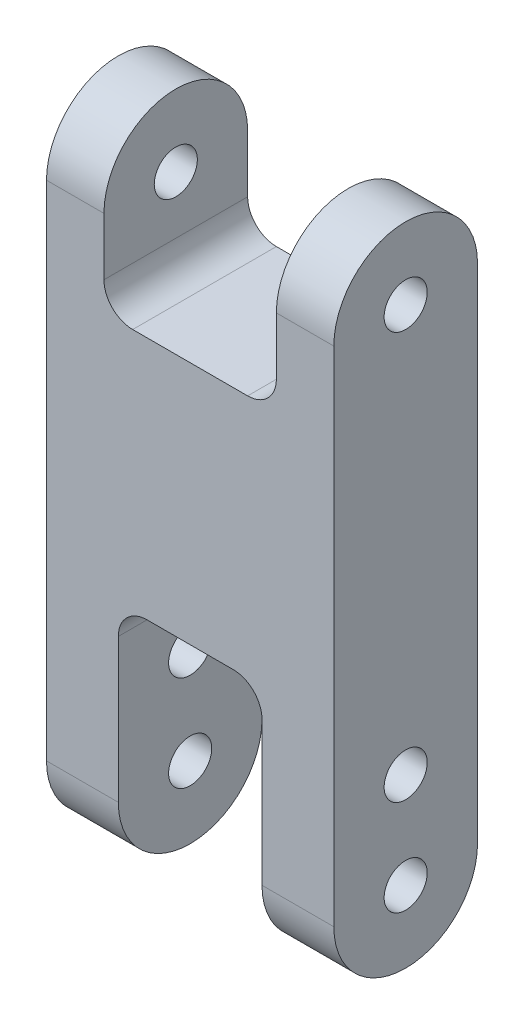
ISO-10303-21;
HEADER;
FILE_DESCRIPTION(('STEP AP214'),'2;1');
FILE_NAME('part.step','',(''),(''),'','','');
FILE_SCHEMA(('AUTOMOTIVE_DESIGN { 1 0 10303 214 1 1 1 1 }'));
ENDSEC;
DATA;
#1=APPLICATION_CONTEXT('core data for automotive mechanical design processes');
#2=APPLICATION_PROTOCOL_DEFINITION('international standard','automotive_design',2000,#1);
#3=PRODUCT_CONTEXT('',#1,'mechanical');
#4=PRODUCT('Part','Part','',(#3));
#5=PRODUCT_RELATED_PRODUCT_CATEGORY('part','',(#4));
#6=PRODUCT_DEFINITION_FORMATION('','',#4);
#7=PRODUCT_DEFINITION_CONTEXT('part definition',#1,'design');
#8=PRODUCT_DEFINITION('design','',#6,#7);
#9=PRODUCT_DEFINITION_SHAPE('','',#8);
#10=(LENGTH_UNIT() NAMED_UNIT(*) SI_UNIT(.MILLI.,.METRE.));
#11=(NAMED_UNIT(*) PLANE_ANGLE_UNIT() SI_UNIT($,.RADIAN.));
#12=(NAMED_UNIT(*) SI_UNIT($,.STERADIAN.) SOLID_ANGLE_UNIT());
#13=UNCERTAINTY_MEASURE_WITH_UNIT(LENGTH_MEASURE(1.E-05),#10,'distance_accuracy_value','');
#14=(GEOMETRIC_REPRESENTATION_CONTEXT(3) GLOBAL_UNCERTAINTY_ASSIGNED_CONTEXT((#13)) GLOBAL_UNIT_ASSIGNED_CONTEXT((#10,
#11,#12)) REPRESENTATION_CONTEXT('',''));
#15=CARTESIAN_POINT('',(0.,0.,0.));
#16=DIRECTION('',(0.,0.,1.));
#17=DIRECTION('',(1.,0.,0.));
#18=AXIS2_PLACEMENT_3D('',#15,#16,#17);
#19=CARTESIAN_POINT('',(-13.5185086744538,19.1447570284714,10.));
#20=DIRECTION('',(1.,0.,0.));
#21=DIRECTION('',(0.,1.,0.));
#22=AXIS2_PLACEMENT_3D('',#19,#20,#21);
#23=PLANE('',#22);
#24=CARTESIAN_POINT('',(-13.5185086744538,14.1447570284714,5.));
#25=DIRECTION('',(-1.,0.,0.));
#26=DIRECTION('',(0.,0.,1.));
#27=AXIS2_PLACEMENT_3D('',#24,#25,#26);
#28=CIRCLE('',#27,1.5);
#29=CARTESIAN_POINT('',(-13.5185086744538,14.1447570284714,6.5));
#30=VERTEX_POINT('',#29);
#31=EDGE_CURVE('E442',#30,#30,#28,.T.);
#32=ORIENTED_EDGE('',*,*,#31,.F.);
#33=EDGE_LOOP('',(#32));
#34=FACE_BOUND('',#33,.T.);
#35=CARTESIAN_POINT('',(-13.5185086744538,-20.8552429715286,5.));
#36=DIRECTION('',(-1.,0.,0.));
#37=DIRECTION('',(0.,0.,1.));
#38=AXIS2_PLACEMENT_3D('',#35,#36,#37);
#39=CIRCLE('',#38,1.5);
#40=CARTESIAN_POINT('',(-13.5185086744538,-20.8552429715286,6.5));
#41=VERTEX_POINT('',#40);
#42=EDGE_CURVE('E285',#41,#41,#39,.T.);
#43=ORIENTED_EDGE('',*,*,#42,.F.);
#44=EDGE_LOOP('',(#43));
#45=FACE_BOUND('',#44,.T.);
#46=CARTESIAN_POINT('',(-13.5185086744538,14.1447570284714,5.));
#47=DIRECTION('',(-1.,0.,0.));
#48=DIRECTION('',(0.,0.,1.));
#49=AXIS2_PLACEMENT_3D('',#46,#47,#48);
#50=CIRCLE('',#49,5.);
#51=CARTESIAN_POINT('',(-13.5185086744538,14.1447570284714,0.));
#52=VERTEX_POINT('',#51);
#53=CARTESIAN_POINT('',(-13.5185086744538,14.1447570284714,10.));
#54=VERTEX_POINT('',#53);
#55=EDGE_CURVE('E310',#52,#54,#50,.F.);
#56=ORIENTED_EDGE('',*,*,#55,.F.);
#57=DIRECTION('',(0.,-1.,0.));
#58=VECTOR('',#57,1.);
#59=CARTESIAN_POINT('',(-13.5185086744538,19.1447570284714,0.));
#60=LINE('',#59,#58);
#61=CARTESIAN_POINT('',(-13.5185086744538,-20.8552429715286,0.));
#62=VERTEX_POINT('',#61);
#63=EDGE_CURVE('E325',#52,#62,#60,.T.);
#64=ORIENTED_EDGE('',*,*,#63,.T.);
#65=CARTESIAN_POINT('',(-13.5185086744538,-20.8552429715286,5.));
#66=DIRECTION('',(-1.,0.,0.));
#67=DIRECTION('',(0.,0.,1.));
#68=AXIS2_PLACEMENT_3D('',#65,#66,#67);
#69=CIRCLE('',#68,5.);
#70=CARTESIAN_POINT('',(-13.5185086744538,-20.8552429715286,10.));
#71=VERTEX_POINT('',#70);
#72=EDGE_CURVE('E314',#62,#71,#69,.T.);
#73=ORIENTED_EDGE('',*,*,#72,.T.);
#74=DIRECTION('',(0.,-1.,0.));
#75=VECTOR('',#74,1.);
#76=CARTESIAN_POINT('',(-13.5185086744538,19.1447570284714,10.));
#77=LINE('',#76,#75);
#78=EDGE_CURVE('E255',#54,#71,#77,.T.);
#79=ORIENTED_EDGE('',*,*,#78,.F.);
#80=EDGE_LOOP('',(#56,#64,#73,#79));
#81=FACE_BOUND('',#80,.T.);
#82=CARTESIAN_POINT('',(-13.5185086744538,-14.1952429715286,5.));
#83=DIRECTION('',(-1.,0.,0.));
#84=DIRECTION('',(0.,0.,1.));
#85=AXIS2_PLACEMENT_3D('',#82,#83,#84);
#86=CIRCLE('',#85,1.5);
#87=CARTESIAN_POINT('',(-13.5185086744538,-14.1952429715286,6.5));
#88=VERTEX_POINT('',#87);
#89=EDGE_CURVE('E581',#88,#88,#86,.T.);
#90=ORIENTED_EDGE('',*,*,#89,.F.);
#91=EDGE_LOOP('',(#90));
#92=FACE_BOUND('',#91,.T.);
#93=ADVANCED_FACE('F99',(#34,#45,#81,#92),#23,.F.);
#94=CARTESIAN_POINT('',(6.48149132554615,19.1447570284714,10.));
#95=DIRECTION('',(1.,0.,0.));
#96=DIRECTION('',(0.,1.,0.));
#97=AXIS2_PLACEMENT_3D('',#94,#95,#96);
#98=PLANE('',#97);
#99=CARTESIAN_POINT('',(6.48149132554615,-20.8552429715286,5.));
#100=DIRECTION('',(-1.,0.,0.));
#101=DIRECTION('',(0.,0.,1.));
#102=AXIS2_PLACEMENT_3D('',#99,#100,#101);
#103=CIRCLE('',#102,1.5);
#104=CARTESIAN_POINT('',(6.48149132554615,-20.8552429715286,6.5));
#105=VERTEX_POINT('',#104);
#106=EDGE_CURVE('E302',#105,#105,#103,.T.);
#107=ORIENTED_EDGE('',*,*,#106,.T.);
#108=EDGE_LOOP('',(#107));
#109=FACE_BOUND('',#108,.T.);
#110=DIRECTION('',(0.,-1.,0.));
#111=VECTOR('',#110,1.);
#112=CARTESIAN_POINT('',(6.48149132554615,19.1447570284714,0.));
#113=LINE('',#112,#111);
#114=CARTESIAN_POINT('',(6.48149132554615,14.1447570284714,0.));
#115=VERTEX_POINT('',#114);
#116=CARTESIAN_POINT('',(6.48149132554615,-20.8552429715286,0.));
#117=VERTEX_POINT('',#116);
#118=EDGE_CURVE('E228',#115,#117,#113,.T.);
#119=ORIENTED_EDGE('',*,*,#118,.F.);
#120=CARTESIAN_POINT('',(6.48149132554615,14.1447570284714,5.));
#121=DIRECTION('',(-1.,0.,0.));
#122=DIRECTION('',(0.,0.,1.));
#123=AXIS2_PLACEMENT_3D('',#120,#121,#122);
#124=CIRCLE('',#123,5.);
#125=CARTESIAN_POINT('',(6.48149132554615,14.1447570284714,10.));
#126=VERTEX_POINT('',#125);
#127=EDGE_CURVE('E214',#115,#126,#124,.F.);
#128=ORIENTED_EDGE('',*,*,#127,.T.);
#129=DIRECTION('',(0.,-1.,0.));
#130=VECTOR('',#129,1.);
#131=CARTESIAN_POINT('',(6.48149132554615,19.1447570284714,10.));
#132=LINE('',#131,#130);
#133=CARTESIAN_POINT('',(6.48149132554615,-20.8552429715286,10.));
#134=VERTEX_POINT('',#133);
#135=EDGE_CURVE('E123',#126,#134,#132,.T.);
#136=ORIENTED_EDGE('',*,*,#135,.T.);
#137=CARTESIAN_POINT('',(6.48149132554615,-20.8552429715286,5.));
#138=DIRECTION('',(-1.,0.,0.));
#139=DIRECTION('',(0.,0.,1.));
#140=AXIS2_PLACEMENT_3D('',#137,#138,#139);
#141=CIRCLE('',#140,5.);
#142=EDGE_CURVE('E237',#117,#134,#141,.T.);
#143=ORIENTED_EDGE('',*,*,#142,.F.);
#144=EDGE_LOOP('',(#119,#128,#136,#143));
#145=FACE_BOUND('',#144,.T.);
#146=CARTESIAN_POINT('',(6.48149132554615,14.1447570284714,5.));
#147=DIRECTION('',(-1.,0.,0.));
#148=DIRECTION('',(0.,0.,1.));
#149=AXIS2_PLACEMENT_3D('',#146,#147,#148);
#150=CIRCLE('',#149,1.5);
#151=CARTESIAN_POINT('',(6.48149132554615,14.1447570284714,6.5));
#152=VERTEX_POINT('',#151);
#153=EDGE_CURVE('E391',#152,#152,#150,.T.);
#154=ORIENTED_EDGE('',*,*,#153,.T.);
#155=EDGE_LOOP('',(#154));
#156=FACE_BOUND('',#155,.T.);
#157=CARTESIAN_POINT('',(6.48149132554615,-14.1952429715286,5.));
#158=DIRECTION('',(-1.,0.,0.));
#159=DIRECTION('',(0.,0.,1.));
#160=AXIS2_PLACEMENT_3D('',#157,#158,#159);
#161=CIRCLE('',#160,1.5);
#162=CARTESIAN_POINT('',(6.48149132554615,-14.1952429715286,6.5));
#163=VERTEX_POINT('',#162);
#164=EDGE_CURVE('E583',#163,#163,#161,.T.);
#165=ORIENTED_EDGE('',*,*,#164,.T.);
#166=EDGE_LOOP('',(#165));
#167=FACE_BOUND('',#166,.T.);
#168=ADVANCED_FACE('F235',(#109,#145,#156,#167),#98,.T.);
#169=CARTESIAN_POINT('',(-6.51850867445384,-10.8552429715286,0.));
#170=DIRECTION('',(0.,0.,-1.));
#171=DIRECTION('',(-1.,0.,0.));
#172=AXIS2_PLACEMENT_3D('',#169,#170,#171);
#173=PLANE('',#172);
#174=ORIENTED_EDGE('',*,*,#63,.F.);
#175=DIRECTION('',(-1.,0.,0.));
#176=VECTOR('',#175,1.);
#177=CARTESIAN_POINT('',(6.48149132554615,14.1447570284714,0.));
#178=LINE('',#177,#176);
#179=CARTESIAN_POINT('',(-9.51850867445384,14.1447570284714,0.));
#180=VERTEX_POINT('',#179);
#181=EDGE_CURVE('E233',#180,#52,#178,.T.);
#182=ORIENTED_EDGE('',*,*,#181,.F.);
#183=DIRECTION('',(0.,1.,0.));
#184=VECTOR('',#183,1.);
#185=CARTESIAN_POINT('',(-9.51850867445384,10.1447570284714,0.));
#186=LINE('',#185,#184);
#187=CARTESIAN_POINT('',(-9.51850867445384,10.1447570284714,0.));
#188=VERTEX_POINT('',#187);
#189=EDGE_CURVE('E252',#188,#180,#186,.T.);
#190=ORIENTED_EDGE('',*,*,#189,.F.);
#191=CARTESIAN_POINT('',(-7.51850867445384,10.1447570284714,0.));
#192=DIRECTION('',(0.,0.,-1.));
#193=DIRECTION('',(-1.,0.,0.));
#194=AXIS2_PLACEMENT_3D('',#191,#192,#193);
#195=CIRCLE('',#194,2.);
#196=CARTESIAN_POINT('',(-7.51850867445383,8.14475702847143,0.));
#197=VERTEX_POINT('',#196);
#198=EDGE_CURVE('E250',#197,#188,#195,.T.);
#199=ORIENTED_EDGE('',*,*,#198,.F.);
#200=DIRECTION('',(-1.,0.,0.));
#201=VECTOR('',#200,1.);
#202=CARTESIAN_POINT('',(0.481491325546142,8.14475702847143,0.));
#203=LINE('',#202,#201);
#204=CARTESIAN_POINT('',(0.481491325546142,8.14475702847143,0.));
#205=VERTEX_POINT('',#204);
#206=EDGE_CURVE('E248',#205,#197,#203,.T.);
#207=ORIENTED_EDGE('',*,*,#206,.F.);
#208=CARTESIAN_POINT('',(0.481491325546156,10.1447570284714,0.));
#209=DIRECTION('',(0.,0.,-1.));
#210=DIRECTION('',(-1.,0.,0.));
#211=AXIS2_PLACEMENT_3D('',#208,#209,#210);
#212=CIRCLE('',#211,2.);
#213=CARTESIAN_POINT('',(2.48149132554616,10.1447570284714,0.));
#214=VERTEX_POINT('',#213);
#215=EDGE_CURVE('E241',#214,#205,#212,.T.);
#216=ORIENTED_EDGE('',*,*,#215,.F.);
#217=DIRECTION('',(0.,1.,0.));
#218=VECTOR('',#217,1.);
#219=CARTESIAN_POINT('',(2.48149132554616,10.1447570284714,0.));
#220=LINE('',#219,#218);
#221=CARTESIAN_POINT('',(2.48149132554616,14.1447570284714,0.));
#222=VERTEX_POINT('',#221);
#223=EDGE_CURVE('E231',#214,#222,#220,.T.);
#224=ORIENTED_EDGE('',*,*,#223,.T.);
#225=EDGE_CURVE('E217',#115,#222,#178,.T.);
#226=ORIENTED_EDGE('',*,*,#225,.F.);
#227=ORIENTED_EDGE('',*,*,#118,.T.);
#228=DIRECTION('',(-1.,0.,0.));
#229=VECTOR('',#228,1.);
#230=CARTESIAN_POINT('',(6.48149132554615,-20.8552429715286,0.));
#231=LINE('',#230,#229);
#232=CARTESIAN_POINT('',(1.48149132554616,-20.8552429715286,0.));
#233=VERTEX_POINT('',#232);
#234=EDGE_CURVE('E300',#117,#233,#231,.T.);
#235=ORIENTED_EDGE('',*,*,#234,.T.);
#236=DIRECTION('',(0.,1.,0.));
#237=VECTOR('',#236,1.);
#238=CARTESIAN_POINT('',(1.48149132554616,-25.8552429715286,0.));
#239=LINE('',#238,#237);
#240=CARTESIAN_POINT('',(1.48149132554616,-10.8552429715286,0.));
#241=VERTEX_POINT('',#240);
#242=EDGE_CURVE('E239',#233,#241,#239,.T.);
#243=ORIENTED_EDGE('',*,*,#242,.T.);
#244=CARTESIAN_POINT('',(-0.518508674453842,-10.8552429715286,0.));
#245=DIRECTION('',(0.,0.,1.));
#246=DIRECTION('',(1.,0.,0.));
#247=AXIS2_PLACEMENT_3D('',#244,#245,#246);
#248=CIRCLE('',#247,2.);
#249=CARTESIAN_POINT('',(-0.518508674453842,-8.85524297152857,0.));
#250=VERTEX_POINT('',#249);
#251=EDGE_CURVE('E243',#241,#250,#248,.T.);
#252=ORIENTED_EDGE('',*,*,#251,.T.);
#253=DIRECTION('',(1.,0.,0.));
#254=VECTOR('',#253,1.);
#255=CARTESIAN_POINT('',(-6.51850867445384,-8.85524297152857,0.));
#256=LINE('',#255,#254);
#257=CARTESIAN_POINT('',(-6.51850867445384,-8.85524297152857,0.));
#258=VERTEX_POINT('',#257);
#259=EDGE_CURVE('E355',#258,#250,#256,.T.);
#260=ORIENTED_EDGE('',*,*,#259,.F.);
#261=CARTESIAN_POINT('',(-6.51850867445384,-10.8552429715286,0.));
#262=DIRECTION('',(0.,0.,-1.));
#263=DIRECTION('',(-1.,0.,0.));
#264=AXIS2_PLACEMENT_3D('',#261,#262,#263);
#265=CIRCLE('',#264,2.);
#266=CARTESIAN_POINT('',(-8.51850867445384,-10.8552429715286,0.));
#267=VERTEX_POINT('',#266);
#268=EDGE_CURVE('E353',#267,#258,#265,.T.);
#269=ORIENTED_EDGE('',*,*,#268,.F.);
#270=DIRECTION('',(0.,1.,0.));
#271=VECTOR('',#270,1.);
#272=CARTESIAN_POINT('',(-8.51850867445384,-25.8552429715286,0.));
#273=LINE('',#272,#271);
#274=CARTESIAN_POINT('',(-8.51850867445384,-20.8552429715286,0.));
#275=VERTEX_POINT('',#274);
#276=EDGE_CURVE('E351',#275,#267,#273,.T.);
#277=ORIENTED_EDGE('',*,*,#276,.F.);
#278=DIRECTION('',(-1.,0.,0.));
#279=VECTOR('',#278,1.);
#280=CARTESIAN_POINT('',(6.48149132554615,-20.8552429715286,0.));
#281=LINE('',#280,#279);
#282=EDGE_CURVE('E12',#275,#62,#281,.T.);
#283=ORIENTED_EDGE('',*,*,#282,.T.);
#284=EDGE_LOOP('',(#174,#182,#190,#199,#207,#216,#224,#226,#227,#235,#243,#252,#260,#269,#277,#283));
#285=FACE_BOUND('',#284,.T.);
#286=ADVANCED_FACE('F226',(#285),#173,.T.);
#287=CARTESIAN_POINT('',(2.48149132554616,10.1447570284714,10.));
#288=DIRECTION('',(-1.,0.,0.));
#289=DIRECTION('',(0.,-1.,0.));
#290=AXIS2_PLACEMENT_3D('',#287,#288,#289);
#291=PLANE('',#290);
#292=CARTESIAN_POINT('',(2.48149132554616,14.1447570284714,5.));
#293=DIRECTION('',(-1.,0.,0.));
#294=DIRECTION('',(0.,-1.,0.));
#295=AXIS2_PLACEMENT_3D('',#292,#293,#294);
#296=CIRCLE('',#295,5.);
#297=CARTESIAN_POINT('',(2.48149132554616,14.1447570284714,10.));
#298=VERTEX_POINT('',#297);
#299=EDGE_CURVE('E311',#222,#298,#296,.F.);
#300=ORIENTED_EDGE('',*,*,#299,.F.);
#301=ORIENTED_EDGE('',*,*,#223,.F.);
#302=DIRECTION('',(0.,0.,-1.));
#303=VECTOR('',#302,1.);
#304=CARTESIAN_POINT('',(2.48149132554616,10.1447570284714,10.));
#305=LINE('',#304,#303);
#306=CARTESIAN_POINT('',(2.48149132554616,10.1447570284714,10.));
#307=VERTEX_POINT('',#306);
#308=EDGE_CURVE('E266',#307,#214,#305,.T.);
#309=ORIENTED_EDGE('',*,*,#308,.F.);
#310=DIRECTION('',(0.,1.,0.));
#311=VECTOR('',#310,1.);
#312=CARTESIAN_POINT('',(2.48149132554616,10.1447570284714,10.));
#313=LINE('',#312,#311);
#314=EDGE_CURVE('E339',#307,#298,#313,.T.);
#315=ORIENTED_EDGE('',*,*,#314,.T.);
#316=EDGE_LOOP('',(#300,#301,#309,#315));
#317=FACE_BOUND('',#316,.T.);
#318=CARTESIAN_POINT('',(2.48149132554616,14.1447570284714,5.));
#319=DIRECTION('',(-1.,0.,0.));
#320=DIRECTION('',(0.,-1.,0.));
#321=AXIS2_PLACEMENT_3D('',#318,#319,#320);
#322=CIRCLE('',#321,1.5);
#323=CARTESIAN_POINT('',(2.48149132554616,12.6447570284714,5.));
#324=VERTEX_POINT('',#323);
#325=EDGE_CURVE('E287',#324,#324,#322,.T.);
#326=ORIENTED_EDGE('',*,*,#325,.F.);
#327=EDGE_LOOP('',(#326));
#328=FACE_BOUND('',#327,.T.);
#329=ADVANCED_FACE('F410',(#317,#328),#291,.T.);
#330=CARTESIAN_POINT('',(-9.51850867445384,10.1447570284714,10.));
#331=DIRECTION('',(-1.,0.,0.));
#332=DIRECTION('',(0.,0.,1.));
#333=AXIS2_PLACEMENT_3D('',#330,#331,#332);
#334=PLANE('',#333);
#335=ORIENTED_EDGE('',*,*,#189,.T.);
#336=CARTESIAN_POINT('',(-9.51850867445384,14.1447570284714,5.));
#337=DIRECTION('',(-1.,0.,0.));
#338=DIRECTION('',(0.,0.,1.));
#339=AXIS2_PLACEMENT_3D('',#336,#337,#338);
#340=CIRCLE('',#339,5.);
#341=CARTESIAN_POINT('',(-9.51850867445384,14.1447570284714,10.));
#342=VERTEX_POINT('',#341);
#343=EDGE_CURVE('E107',#180,#342,#340,.F.);
#344=ORIENTED_EDGE('',*,*,#343,.T.);
#345=DIRECTION('',(0.,1.,0.));
#346=VECTOR('',#345,1.);
#347=CARTESIAN_POINT('',(-9.51850867445384,10.1447570284714,10.));
#348=LINE('',#347,#346);
#349=CARTESIAN_POINT('',(-9.51850867445384,10.1447570284714,10.));
#350=VERTEX_POINT('',#349);
#351=EDGE_CURVE('E260',#350,#342,#348,.T.);
#352=ORIENTED_EDGE('',*,*,#351,.F.);
#353=DIRECTION('',(0.,0.,-1.));
#354=VECTOR('',#353,1.);
#355=CARTESIAN_POINT('',(-9.51850867445384,10.1447570284714,10.));
#356=LINE('',#355,#354);
#357=EDGE_CURVE('E256',#350,#188,#356,.T.);
#358=ORIENTED_EDGE('',*,*,#357,.T.);
#359=EDGE_LOOP('',(#335,#344,#352,#358));
#360=FACE_BOUND('',#359,.T.);
#361=CARTESIAN_POINT('',(-9.51850867445384,14.1447570284714,5.));
#362=DIRECTION('',(-1.,0.,0.));
#363=DIRECTION('',(0.,0.,1.));
#364=AXIS2_PLACEMENT_3D('',#361,#362,#363);
#365=CIRCLE('',#364,1.5);
#366=CARTESIAN_POINT('',(-9.51850867445384,14.1447570284714,6.5));
#367=VERTEX_POINT('',#366);
#368=EDGE_CURVE('E232',#367,#367,#365,.T.);
#369=ORIENTED_EDGE('',*,*,#368,.T.);
#370=EDGE_LOOP('',(#369));
#371=FACE_BOUND('',#370,.T.);
#372=ADVANCED_FACE('F393',(#360,#371),#334,.F.);
#373=CARTESIAN_POINT('',(-8.51850867445384,-25.8552429715286,10.));
#374=DIRECTION('',(-1.,0.,0.));
#375=DIRECTION('',(0.,-1.,0.));
#376=AXIS2_PLACEMENT_3D('',#373,#374,#375);
#377=PLANE('',#376);
#378=CARTESIAN_POINT('',(-8.51850867445384,-14.1952429715286,5.));
#379=DIRECTION('',(-1.,0.,0.));
#380=DIRECTION('',(0.,-1.,0.));
#381=AXIS2_PLACEMENT_3D('',#378,#379,#380);
#382=CIRCLE('',#381,1.5);
#383=CARTESIAN_POINT('',(-8.51850867445384,-15.6952429715286,5.));
#384=VERTEX_POINT('',#383);
#385=EDGE_CURVE('E295',#384,#384,#382,.T.);
#386=ORIENTED_EDGE('',*,*,#385,.T.);
#387=EDGE_LOOP('',(#386));
#388=FACE_BOUND('',#387,.T.);
#389=CARTESIAN_POINT('',(-8.51850867445384,-20.8552429715286,5.));
#390=DIRECTION('',(-1.,0.,0.));
#391=DIRECTION('',(0.,-1.,0.));
#392=AXIS2_PLACEMENT_3D('',#389,#390,#391);
#393=CIRCLE('',#392,1.5);
#394=CARTESIAN_POINT('',(-8.51850867445384,-22.3552429715286,5.));
#395=VERTEX_POINT('',#394);
#396=EDGE_CURVE('E222',#395,#395,#393,.T.);
#397=ORIENTED_EDGE('',*,*,#396,.T.);
#398=EDGE_LOOP('',(#397));
#399=FACE_BOUND('',#398,.T.);
#400=CARTESIAN_POINT('',(-8.51850867445384,-20.8552429715286,5.));
#401=DIRECTION('',(-1.,0.,0.));
#402=DIRECTION('',(0.,-1.,0.));
#403=AXIS2_PLACEMENT_3D('',#400,#401,#402);
#404=CIRCLE('',#403,5.);
#405=CARTESIAN_POINT('',(-8.51850867445384,-20.8552429715286,10.));
#406=VERTEX_POINT('',#405);
#407=EDGE_CURVE('E323',#275,#406,#404,.T.);
#408=ORIENTED_EDGE('',*,*,#407,.F.);
#409=ORIENTED_EDGE('',*,*,#276,.T.);
#410=DIRECTION('',(0.,0.,-1.));
#411=VECTOR('',#410,1.);
#412=CARTESIAN_POINT('',(-8.51850867445384,-10.8552429715286,10.));
#413=LINE('',#412,#411);
#414=CARTESIAN_POINT('',(-8.51850867445384,-10.8552429715286,10.));
#415=VERTEX_POINT('',#414);
#416=EDGE_CURVE('E276',#415,#267,#413,.T.);
#417=ORIENTED_EDGE('',*,*,#416,.F.);
#418=DIRECTION('',(0.,1.,0.));
#419=VECTOR('',#418,1.);
#420=CARTESIAN_POINT('',(-8.51850867445384,-25.8552429715286,10.));
#421=LINE('',#420,#419);
#422=EDGE_CURVE('E327',#406,#415,#421,.T.);
#423=ORIENTED_EDGE('',*,*,#422,.F.);
#424=EDGE_LOOP('',(#408,#409,#417,#423));
#425=FACE_BOUND('',#424,.T.);
#426=ADVANCED_FACE('F378',(#388,#399,#425),#377,.F.);
#427=CARTESIAN_POINT('',(1.48149132554616,-25.8552429715286,10.));
#428=DIRECTION('',(-1.,0.,0.));
#429=DIRECTION('',(0.,0.,1.));
#430=AXIS2_PLACEMENT_3D('',#427,#428,#429);
#431=PLANE('',#430);
#432=CARTESIAN_POINT('',(1.48149132554616,-14.1952429715286,5.));
#433=DIRECTION('',(-1.,0.,0.));
#434=DIRECTION('',(0.,0.,1.));
#435=AXIS2_PLACEMENT_3D('',#432,#433,#434);
#436=CIRCLE('',#435,1.5);
#437=CARTESIAN_POINT('',(1.48149132554616,-14.1952429715286,6.5));
#438=VERTEX_POINT('',#437);
#439=EDGE_CURVE('E102',#438,#438,#436,.T.);
#440=ORIENTED_EDGE('',*,*,#439,.F.);
#441=EDGE_LOOP('',(#440));
#442=FACE_BOUND('',#441,.T.);
#443=CARTESIAN_POINT('',(1.48149132554616,-20.8552429715286,5.));
#444=DIRECTION('',(-1.,0.,0.));
#445=DIRECTION('',(0.,0.,1.));
#446=AXIS2_PLACEMENT_3D('',#443,#444,#445);
#447=CIRCLE('',#446,1.5);
#448=CARTESIAN_POINT('',(1.48149132554616,-20.8552429715286,6.5));
#449=VERTEX_POINT('',#448);
#450=EDGE_CURVE('E283',#449,#449,#447,.T.);
#451=ORIENTED_EDGE('',*,*,#450,.F.);
#452=EDGE_LOOP('',(#451));
#453=FACE_BOUND('',#452,.T.);
#454=ORIENTED_EDGE('',*,*,#242,.F.);
#455=CARTESIAN_POINT('',(1.48149132554616,-20.8552429715286,5.));
#456=DIRECTION('',(-1.,0.,0.));
#457=DIRECTION('',(0.,0.,1.));
#458=AXIS2_PLACEMENT_3D('',#455,#456,#457);
#459=CIRCLE('',#458,5.);
#460=CARTESIAN_POINT('',(1.48149132554616,-20.8552429715286,10.));
#461=VERTEX_POINT('',#460);
#462=EDGE_CURVE('E320',#233,#461,#459,.T.);
#463=ORIENTED_EDGE('',*,*,#462,.T.);
#464=DIRECTION('',(0.,1.,0.));
#465=VECTOR('',#464,1.);
#466=CARTESIAN_POINT('',(1.48149132554616,-25.8552429715286,10.));
#467=LINE('',#466,#465);
#468=CARTESIAN_POINT('',(1.48149132554616,-10.8552429715286,10.));
#469=VERTEX_POINT('',#468);
#470=EDGE_CURVE('E336',#461,#469,#467,.T.);
#471=ORIENTED_EDGE('',*,*,#470,.T.);
#472=DIRECTION('',(0.,0.,-1.));
#473=VECTOR('',#472,1.);
#474=CARTESIAN_POINT('',(1.48149132554616,-10.8552429715286,10.));
#475=LINE('',#474,#473);
#476=EDGE_CURVE('E268',#469,#241,#475,.T.);
#477=ORIENTED_EDGE('',*,*,#476,.T.);
#478=EDGE_LOOP('',(#454,#463,#471,#477));
#479=FACE_BOUND('',#478,.T.);
#480=ADVANCED_FACE('F419',(#442,#453,#479),#431,.T.);
#481=CARTESIAN_POINT('',(-6.51850867445384,-10.8552429715286,10.));
#482=DIRECTION('',(0.,0.,-1.));
#483=DIRECTION('',(-1.,0.,0.));
#484=AXIS2_PLACEMENT_3D('',#481,#482,#483);
#485=PLANE('',#484);
#486=DIRECTION('',(-1.,0.,0.));
#487=VECTOR('',#486,1.);
#488=CARTESIAN_POINT('',(6.48149132554615,14.1447570284714,10.));
#489=LINE('',#488,#487);
#490=EDGE_CURVE('E115',#342,#54,#489,.T.);
#491=ORIENTED_EDGE('',*,*,#490,.T.);
#492=ORIENTED_EDGE('',*,*,#78,.T.);
#493=DIRECTION('',(-1.,0.,0.));
#494=VECTOR('',#493,1.);
#495=CARTESIAN_POINT('',(6.48149132554615,-20.8552429715286,10.));
#496=LINE('',#495,#494);
#497=EDGE_CURVE('E279',#406,#71,#496,.T.);
#498=ORIENTED_EDGE('',*,*,#497,.F.);
#499=ORIENTED_EDGE('',*,*,#422,.T.);
#500=CARTESIAN_POINT('',(-6.51850867445384,-10.8552429715286,10.));
#501=DIRECTION('',(0.,0.,-1.));
#502=DIRECTION('',(-1.,0.,0.));
#503=AXIS2_PLACEMENT_3D('',#500,#501,#502);
#504=CIRCLE('',#503,2.);
#505=CARTESIAN_POINT('',(-6.51850867445384,-8.85524297152857,10.));
#506=VERTEX_POINT('',#505);
#507=EDGE_CURVE('E329',#415,#506,#504,.T.);
#508=ORIENTED_EDGE('',*,*,#507,.T.);
#509=DIRECTION('',(1.,0.,0.));
#510=VECTOR('',#509,1.);
#511=CARTESIAN_POINT('',(-6.51850867445384,-8.85524297152857,10.));
#512=LINE('',#511,#510);
#513=CARTESIAN_POINT('',(-0.518508674453842,-8.85524297152857,10.));
#514=VERTEX_POINT('',#513);
#515=EDGE_CURVE('E331',#506,#514,#512,.T.);
#516=ORIENTED_EDGE('',*,*,#515,.T.);
#517=CARTESIAN_POINT('',(-0.518508674453842,-10.8552429715286,10.));
#518=DIRECTION('',(0.,0.,1.));
#519=DIRECTION('',(1.,0.,0.));
#520=AXIS2_PLACEMENT_3D('',#517,#518,#519);
#521=CIRCLE('',#520,2.);
#522=EDGE_CURVE('E333',#469,#514,#521,.T.);
#523=ORIENTED_EDGE('',*,*,#522,.F.);
#524=ORIENTED_EDGE('',*,*,#470,.F.);
#525=DIRECTION('',(-1.,0.,0.));
#526=VECTOR('',#525,1.);
#527=CARTESIAN_POINT('',(6.48149132554615,-20.8552429715286,10.));
#528=LINE('',#527,#526);
#529=EDGE_CURVE('E316',#134,#461,#528,.T.);
#530=ORIENTED_EDGE('',*,*,#529,.F.);
#531=ORIENTED_EDGE('',*,*,#135,.F.);
#532=EDGE_CURVE('E220',#126,#298,#489,.T.);
#533=ORIENTED_EDGE('',*,*,#532,.T.);
#534=ORIENTED_EDGE('',*,*,#314,.F.);
#535=CARTESIAN_POINT('',(0.481491325546156,10.1447570284714,10.));
#536=DIRECTION('',(0.,0.,-1.));
#537=DIRECTION('',(-1.,0.,0.));
#538=AXIS2_PLACEMENT_3D('',#535,#536,#537);
#539=CIRCLE('',#538,2.);
#540=CARTESIAN_POINT('',(0.481491325546142,8.14475702847143,10.));
#541=VERTEX_POINT('',#540);
#542=EDGE_CURVE('E342',#307,#541,#539,.T.);
#543=ORIENTED_EDGE('',*,*,#542,.T.);
#544=DIRECTION('',(-1.,0.,0.));
#545=VECTOR('',#544,1.);
#546=CARTESIAN_POINT('',(0.481491325546142,8.14475702847143,10.));
#547=LINE('',#546,#545);
#548=CARTESIAN_POINT('',(-7.51850867445383,8.14475702847143,10.));
#549=VERTEX_POINT('',#548);
#550=EDGE_CURVE('E344',#541,#549,#547,.T.);
#551=ORIENTED_EDGE('',*,*,#550,.T.);
#552=CARTESIAN_POINT('',(-7.51850867445384,10.1447570284714,10.));
#553=DIRECTION('',(0.,0.,-1.));
#554=DIRECTION('',(-1.,0.,0.));
#555=AXIS2_PLACEMENT_3D('',#552,#553,#554);
#556=CIRCLE('',#555,2.);
#557=EDGE_CURVE('E346',#549,#350,#556,.T.);
#558=ORIENTED_EDGE('',*,*,#557,.T.);
#559=ORIENTED_EDGE('',*,*,#351,.T.);
#560=EDGE_LOOP('',(#491,#492,#498,#499,#508,#516,#523,#524,#530,#531,#533,#534,#543,#551,#558,#559));
#561=FACE_BOUND('',#560,.T.);
#562=ADVANCED_FACE('F413',(#561),#485,.F.);
#563=CARTESIAN_POINT('',(-6.51850867445384,-10.8552429715286,10.));
#564=DIRECTION('',(0.,0.,-1.));
#565=DIRECTION('',(-1.,0.,0.));
#566=AXIS2_PLACEMENT_3D('',#563,#564,#565);
#567=CYLINDRICAL_SURFACE('',#566,2.);
#568=ORIENTED_EDGE('',*,*,#268,.T.);
#569=DIRECTION('',(0.,0.,-1.));
#570=VECTOR('',#569,1.);
#571=CARTESIAN_POINT('',(-6.51850867445384,-8.85524297152857,10.));
#572=LINE('',#571,#570);
#573=EDGE_CURVE('E273',#506,#258,#572,.T.);
#574=ORIENTED_EDGE('',*,*,#573,.F.);
#575=ORIENTED_EDGE('',*,*,#507,.F.);
#576=ORIENTED_EDGE('',*,*,#416,.T.);
#577=EDGE_LOOP('',(#568,#574,#575,#576));
#578=FACE_BOUND('',#577,.T.);
#579=ADVANCED_FACE('F373',(#578),#567,.F.);
#580=CARTESIAN_POINT('',(-6.51850867445384,-8.85524297152857,10.));
#581=DIRECTION('',(0.,1.,0.));
#582=DIRECTION('',(0.,0.,1.));
#583=AXIS2_PLACEMENT_3D('',#580,#581,#582);
#584=PLANE('',#583);
#585=ORIENTED_EDGE('',*,*,#259,.T.);
#586=DIRECTION('',(0.,0.,-1.));
#587=VECTOR('',#586,1.);
#588=CARTESIAN_POINT('',(-0.518508674453842,-8.85524297152857,10.));
#589=LINE('',#588,#587);
#590=EDGE_CURVE('E271',#514,#250,#589,.T.);
#591=ORIENTED_EDGE('',*,*,#590,.F.);
#592=ORIENTED_EDGE('',*,*,#515,.F.);
#593=ORIENTED_EDGE('',*,*,#573,.T.);
#594=EDGE_LOOP('',(#585,#591,#592,#593));
#595=FACE_BOUND('',#594,.T.);
#596=ADVANCED_FACE('F369',(#595),#584,.F.);
#597=CARTESIAN_POINT('',(-0.518508674453842,-10.8552429715286,10.));
#598=DIRECTION('',(0.,0.,-1.));
#599=DIRECTION('',(-1.,0.,0.));
#600=AXIS2_PLACEMENT_3D('',#597,#598,#599);
#601=CYLINDRICAL_SURFACE('',#600,2.);
#602=ORIENTED_EDGE('',*,*,#251,.F.);
#603=ORIENTED_EDGE('',*,*,#476,.F.);
#604=ORIENTED_EDGE('',*,*,#522,.T.);
#605=ORIENTED_EDGE('',*,*,#590,.T.);
#606=EDGE_LOOP('',(#602,#603,#604,#605));
#607=FACE_BOUND('',#606,.T.);
#608=ADVANCED_FACE('F364',(#607),#601,.F.);
#609=CARTESIAN_POINT('',(0.481491325546156,10.1447570284714,10.));
#610=DIRECTION('',(0.,0.,-1.));
#611=DIRECTION('',(-1.,0.,0.));
#612=AXIS2_PLACEMENT_3D('',#609,#610,#611);
#613=CYLINDRICAL_SURFACE('',#612,2.);
#614=ORIENTED_EDGE('',*,*,#215,.T.);
#615=DIRECTION('',(0.,0.,-1.));
#616=VECTOR('',#615,1.);
#617=CARTESIAN_POINT('',(0.481491325546142,8.14475702847143,10.));
#618=LINE('',#617,#616);
#619=EDGE_CURVE('E263',#541,#205,#618,.T.);
#620=ORIENTED_EDGE('',*,*,#619,.F.);
#621=ORIENTED_EDGE('',*,*,#542,.F.);
#622=ORIENTED_EDGE('',*,*,#308,.T.);
#623=EDGE_LOOP('',(#614,#620,#621,#622));
#624=FACE_BOUND('',#623,.T.);
#625=ADVANCED_FACE('F407',(#624),#613,.F.);
#626=CARTESIAN_POINT('',(0.481491325546142,8.14475702847143,10.));
#627=DIRECTION('',(0.,-1.,0.));
#628=DIRECTION('',(1.,0.,0.));
#629=AXIS2_PLACEMENT_3D('',#626,#627,#628);
#630=PLANE('',#629);
#631=ORIENTED_EDGE('',*,*,#206,.T.);
#632=DIRECTION('',(0.,0.,-1.));
#633=VECTOR('',#632,1.);
#634=CARTESIAN_POINT('',(-7.51850867445383,8.14475702847143,10.));
#635=LINE('',#634,#633);
#636=EDGE_CURVE('E259',#549,#197,#635,.T.);
#637=ORIENTED_EDGE('',*,*,#636,.F.);
#638=ORIENTED_EDGE('',*,*,#550,.F.);
#639=ORIENTED_EDGE('',*,*,#619,.T.);
#640=EDGE_LOOP('',(#631,#637,#638,#639));
#641=FACE_BOUND('',#640,.T.);
#642=ADVANCED_FACE('F402',(#641),#630,.F.);
#643=CARTESIAN_POINT('',(-7.51850867445384,10.1447570284714,10.));
#644=DIRECTION('',(0.,0.,-1.));
#645=DIRECTION('',(-1.,0.,0.));
#646=AXIS2_PLACEMENT_3D('',#643,#644,#645);
#647=CYLINDRICAL_SURFACE('',#646,2.);
#648=ORIENTED_EDGE('',*,*,#198,.T.);
#649=ORIENTED_EDGE('',*,*,#357,.F.);
#650=ORIENTED_EDGE('',*,*,#557,.F.);
#651=ORIENTED_EDGE('',*,*,#636,.T.);
#652=EDGE_LOOP('',(#648,#649,#650,#651));
#653=FACE_BOUND('',#652,.T.);
#654=ADVANCED_FACE('F398',(#653),#647,.F.);
#655=CARTESIAN_POINT('',(6.48149132554615,-20.8552429715286,5.));
#656=DIRECTION('',(-1.,0.,0.));
#657=DIRECTION('',(0.,0.,1.));
#658=AXIS2_PLACEMENT_3D('',#655,#656,#657);
#659=CYLINDRICAL_SURFACE('',#658,5.);
#660=ORIENTED_EDGE('',*,*,#407,.T.);
#661=ORIENTED_EDGE('',*,*,#497,.T.);
#662=ORIENTED_EDGE('',*,*,#72,.F.);
#663=ORIENTED_EDGE('',*,*,#282,.F.);
#664=EDGE_LOOP('',(#660,#661,#662,#663));
#665=FACE_BOUND('',#664,.T.);
#666=ADVANCED_FACE('F383',(#665),#659,.T.);
#667=ORIENTED_EDGE('',*,*,#462,.F.);
#668=ORIENTED_EDGE('',*,*,#234,.F.);
#669=ORIENTED_EDGE('',*,*,#142,.T.);
#670=ORIENTED_EDGE('',*,*,#529,.T.);
#671=EDGE_LOOP('',(#667,#668,#669,#670));
#672=FACE_BOUND('',#671,.T.);
#673=ADVANCED_FACE('F417',(#672),#659,.T.);
#674=CARTESIAN_POINT('',(6.48149132554615,14.1447570284714,5.));
#675=DIRECTION('',(-1.,0.,0.));
#676=DIRECTION('',(0.,0.,1.));
#677=AXIS2_PLACEMENT_3D('',#674,#675,#676);
#678=CYLINDRICAL_SURFACE('',#677,5.);
#679=ORIENTED_EDGE('',*,*,#343,.F.);
#680=ORIENTED_EDGE('',*,*,#181,.T.);
#681=ORIENTED_EDGE('',*,*,#55,.T.);
#682=ORIENTED_EDGE('',*,*,#490,.F.);
#683=EDGE_LOOP('',(#679,#680,#681,#682));
#684=FACE_BOUND('',#683,.T.);
#685=ADVANCED_FACE('F466',(#684),#678,.T.);
#686=ORIENTED_EDGE('',*,*,#299,.T.);
#687=ORIENTED_EDGE('',*,*,#532,.F.);
#688=ORIENTED_EDGE('',*,*,#127,.F.);
#689=ORIENTED_EDGE('',*,*,#225,.T.);
#690=EDGE_LOOP('',(#686,#687,#688,#689));
#691=FACE_BOUND('',#690,.T.);
#692=ADVANCED_FACE('F216',(#691),#678,.T.);
#693=CARTESIAN_POINT('',(6.48149132554615,-20.8552429715286,5.));
#694=DIRECTION('',(-1.,0.,0.));
#695=DIRECTION('',(0.,0.,1.));
#696=AXIS2_PLACEMENT_3D('',#693,#694,#695);
#697=CYLINDRICAL_SURFACE('',#696,1.5);
#698=ORIENTED_EDGE('',*,*,#450,.T.);
#699=EDGE_LOOP('',(#698));
#700=FACE_BOUND('',#699,.T.);
#701=ORIENTED_EDGE('',*,*,#106,.F.);
#702=EDGE_LOOP('',(#701));
#703=FACE_BOUND('',#702,.T.);
#704=ADVANCED_FACE('F449',(#700,#703),#697,.F.);
#705=ORIENTED_EDGE('',*,*,#42,.T.);
#706=EDGE_LOOP('',(#705));
#707=FACE_BOUND('',#706,.T.);
#708=ORIENTED_EDGE('',*,*,#396,.F.);
#709=EDGE_LOOP('',(#708));
#710=FACE_BOUND('',#709,.T.);
#711=ADVANCED_FACE('F445',(#707,#710),#697,.F.);
#712=CARTESIAN_POINT('',(6.48149132554615,14.1447570284714,5.));
#713=DIRECTION('',(-1.,0.,0.));
#714=DIRECTION('',(0.,0.,1.));
#715=AXIS2_PLACEMENT_3D('',#712,#713,#714);
#716=CYLINDRICAL_SURFACE('',#715,1.5);
#717=ORIENTED_EDGE('',*,*,#31,.T.);
#718=EDGE_LOOP('',(#717));
#719=FACE_BOUND('',#718,.T.);
#720=ORIENTED_EDGE('',*,*,#368,.F.);
#721=EDGE_LOOP('',(#720));
#722=FACE_BOUND('',#721,.T.);
#723=ADVANCED_FACE('F448',(#719,#722),#716,.F.);
#724=ORIENTED_EDGE('',*,*,#325,.T.);
#725=EDGE_LOOP('',(#724));
#726=FACE_BOUND('',#725,.T.);
#727=ORIENTED_EDGE('',*,*,#153,.F.);
#728=EDGE_LOOP('',(#727));
#729=FACE_BOUND('',#728,.T.);
#730=ADVANCED_FACE('F457',(#726,#729),#716,.F.);
#731=CARTESIAN_POINT('',(6.48149132554615,-14.1952429715286,5.));
#732=DIRECTION('',(-1.,0.,0.));
#733=DIRECTION('',(0.,0.,1.));
#734=AXIS2_PLACEMENT_3D('',#731,#732,#733);
#735=CYLINDRICAL_SURFACE('',#734,1.5);
#736=ORIENTED_EDGE('',*,*,#439,.T.);
#737=EDGE_LOOP('',(#736));
#738=FACE_BOUND('',#737,.T.);
#739=ORIENTED_EDGE('',*,*,#164,.F.);
#740=EDGE_LOOP('',(#739));
#741=FACE_BOUND('',#740,.T.);
#742=ADVANCED_FACE('F463',(#738,#741),#735,.F.);
#743=ORIENTED_EDGE('',*,*,#89,.T.);
#744=EDGE_LOOP('',(#743));
#745=FACE_BOUND('',#744,.T.);
#746=ORIENTED_EDGE('',*,*,#385,.F.);
#747=EDGE_LOOP('',(#746));
#748=FACE_BOUND('',#747,.T.);
#749=ADVANCED_FACE('F566',(#745,#748),#735,.F.);
#750=CLOSED_SHELL('',(#93,#168,#286,#329,#372,#426,#480,#562,#579,#596,#608,#625,#642,#654,#666,
#673,#685,#692,#704,#711,#723,#730,#742,#749));
#751=MANIFOLD_SOLID_BREP('B2',#750);
#752=ADVANCED_BREP_SHAPE_REPRESENTATION('',(#18,#751),#14);
#753=SHAPE_DEFINITION_REPRESENTATION(#9,#752);
ENDSEC;
END-ISO-10303-21;
